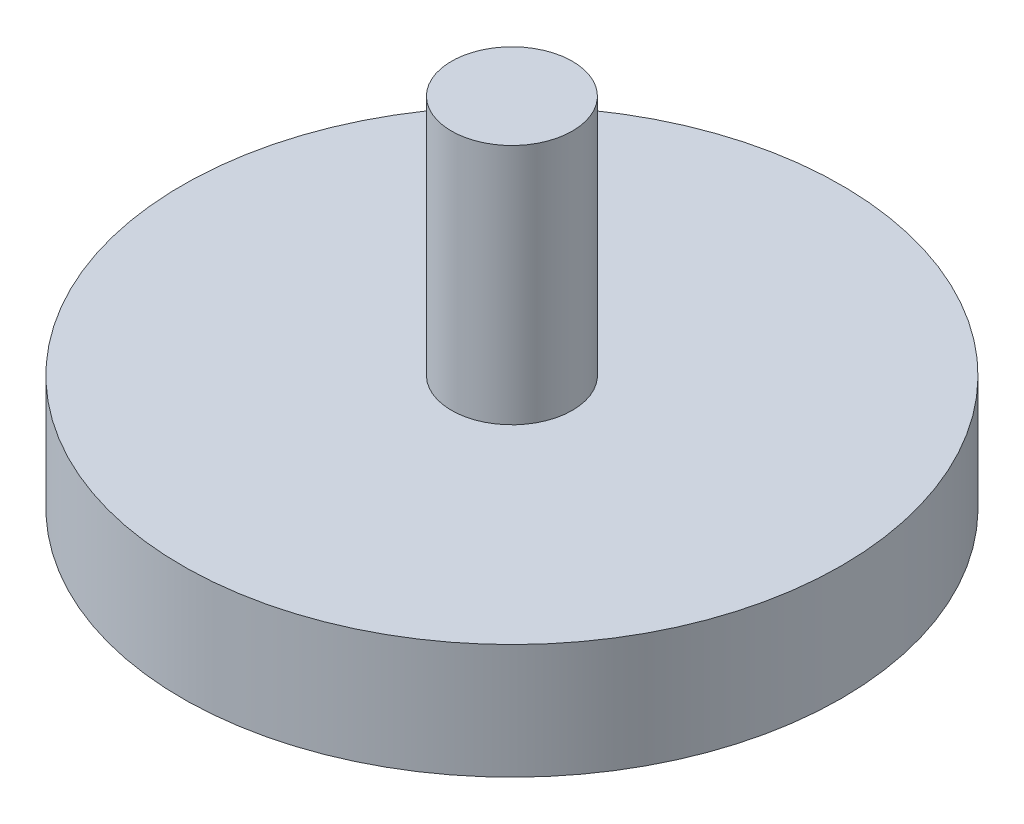
ISO-10303-21;
HEADER;
FILE_DESCRIPTION(('STEP AP214'),'2;1');
FILE_NAME('part.step','',(''),(''),'','','');
FILE_SCHEMA(('AUTOMOTIVE_DESIGN { 1 0 10303 214 1 1 1 1 }'));
ENDSEC;
DATA;
#1=APPLICATION_CONTEXT('core data for automotive mechanical design processes');
#2=APPLICATION_PROTOCOL_DEFINITION('international standard','automotive_design',2000,#1);
#3=PRODUCT_CONTEXT('',#1,'mechanical');
#4=PRODUCT('Part','Part','',(#3));
#5=PRODUCT_RELATED_PRODUCT_CATEGORY('part','',(#4));
#6=PRODUCT_DEFINITION_FORMATION('','',#4);
#7=PRODUCT_DEFINITION_CONTEXT('part definition',#1,'design');
#8=PRODUCT_DEFINITION('design','',#6,#7);
#9=PRODUCT_DEFINITION_SHAPE('','',#8);
#10=(LENGTH_UNIT() NAMED_UNIT(*) SI_UNIT(.MILLI.,.METRE.));
#11=(NAMED_UNIT(*) PLANE_ANGLE_UNIT() SI_UNIT($,.RADIAN.));
#12=(NAMED_UNIT(*) SI_UNIT($,.STERADIAN.) SOLID_ANGLE_UNIT());
#13=UNCERTAINTY_MEASURE_WITH_UNIT(LENGTH_MEASURE(1.E-05),#10,'distance_accuracy_value','');
#14=(GEOMETRIC_REPRESENTATION_CONTEXT(3) GLOBAL_UNCERTAINTY_ASSIGNED_CONTEXT((#13)) GLOBAL_UNIT_ASSIGNED_CONTEXT((#10,
#11,#12)) REPRESENTATION_CONTEXT('',''));
#15=CARTESIAN_POINT('',(0.,0.,0.));
#16=DIRECTION('',(0.,0.,1.));
#17=DIRECTION('',(1.,0.,0.));
#18=AXIS2_PLACEMENT_3D('',#15,#16,#17);
#19=CARTESIAN_POINT('',(30.,29.9999999999999,0.));
#20=DIRECTION('',(0.,-1.,0.));
#21=DIRECTION('',(1.,0.,0.));
#22=AXIS2_PLACEMENT_3D('',#19,#20,#21);
#23=PLANE('',#22);
#24=CARTESIAN_POINT('',(-1.02907469966572E-13,29.9999999999996,0.));
#25=DIRECTION('',(0.,-1.,0.));
#26=DIRECTION('',(1.,0.,0.));
#27=AXIS2_PLACEMENT_3D('',#24,#25,#26);
#28=CIRCLE('',#27,109.);
#29=CARTESIAN_POINT('',(109.,30.,0.));
#30=VERTEX_POINT('',#29);
#31=EDGE_CURVE('E110',#30,#30,#28,.T.);
#32=ORIENTED_EDGE('',*,*,#31,.T.);
#33=EDGE_LOOP('',(#32));
#34=FACE_BOUND('',#33,.T.);
#35=CARTESIAN_POINT('',(-1.02907469966574E-13,30.,0.));
#36=DIRECTION('',(0.,-1.,0.));
#37=DIRECTION('',(1.,0.,0.));
#38=AXIS2_PLACEMENT_3D('',#35,#36,#37);
#39=CIRCLE('',#38,30.0000000000001);
#40=CARTESIAN_POINT('',(-7.50000000000011,29.9999999999997,29.0473750965557));
#41=VERTEX_POINT('',#40);
#42=CARTESIAN_POINT('',(7.49999999999989,29.9999999999998,29.0473750965557));
#43=VERTEX_POINT('',#42);
#44=EDGE_CURVE('E108',#41,#43,#39,.T.);
#45=ORIENTED_EDGE('',*,*,#44,.F.);
#46=DIRECTION('',(0.,0.,-1.));
#47=VECTOR('',#46,1.);
#48=CARTESIAN_POINT('',(-7.50000000000011,29.9999999999997,45.));
#49=LINE('',#48,#47);
#50=CARTESIAN_POINT('',(-7.50000000000011,29.9999999999997,45.));
#51=VERTEX_POINT('',#50);
#52=EDGE_CURVE('E55',#51,#41,#49,.T.);
#53=ORIENTED_EDGE('',*,*,#52,.F.);
#54=DIRECTION('',(-1.,0.,0.));
#55=VECTOR('',#54,1.);
#56=CARTESIAN_POINT('',(-7.50000000000011,29.9999999999997,45.));
#57=LINE('',#56,#55);
#58=CARTESIAN_POINT('',(7.49999999999989,29.9999999999998,45.));
#59=VERTEX_POINT('',#58);
#60=EDGE_CURVE('E84',#59,#51,#57,.T.);
#61=ORIENTED_EDGE('',*,*,#60,.F.);
#62=DIRECTION('',(0.,0.,1.));
#63=VECTOR('',#62,1.);
#64=CARTESIAN_POINT('',(7.49999999999989,29.9999999999998,45.));
#65=LINE('',#64,#63);
#66=EDGE_CURVE('E74',#43,#59,#65,.T.);
#67=ORIENTED_EDGE('',*,*,#66,.F.);
#68=EDGE_LOOP('',(#45,#53,#61,#67));
#69=FACE_BOUND('',#68,.T.);
#70=ADVANCED_FACE('F32',(#34,#69),#23,.T.);
#71=CARTESIAN_POINT('',(3.43024899888577E-12,-1000.,0.));
#72=DIRECTION('',(0.,-1.,0.));
#73=DIRECTION('',(1.,0.,0.));
#74=AXIS2_PLACEMENT_3D('',#71,#72,#73);
#75=CYLINDRICAL_SURFACE('',#74,30.0000000000001);
#76=CARTESIAN_POINT('',(0.,4.99999999999989,0.));
#77=DIRECTION('',(0.,-1.,0.));
#78=DIRECTION('',(1.,0.,0.));
#79=AXIS2_PLACEMENT_3D('',#76,#77,#78);
#80=CIRCLE('',#79,30.);
#81=CARTESIAN_POINT('',(-7.50000000000002,4.99999999999984,29.0473750965556));
#82=VERTEX_POINT('',#81);
#83=CARTESIAN_POINT('',(7.49999999999998,4.99999999999989,29.0473750965556));
#84=VERTEX_POINT('',#83);
#85=EDGE_CURVE('E105',#82,#84,#80,.T.);
#86=ORIENTED_EDGE('',*,*,#85,.F.);
#87=DIRECTION('',(0.,-1.,0.));
#88=VECTOR('',#87,1.);
#89=CARTESIAN_POINT('',(-7.49999999999657,-1000.,29.0473750965557));
#90=LINE('',#89,#88);
#91=EDGE_CURVE('E96',#82,#41,#90,.F.);
#92=ORIENTED_EDGE('',*,*,#91,.T.);
#93=ORIENTED_EDGE('',*,*,#44,.T.);
#94=DIRECTION('',(0.,-1.,0.));
#95=VECTOR('',#94,1.);
#96=CARTESIAN_POINT('',(7.50000000000342,-1000.,29.0473750965557));
#97=LINE('',#96,#95);
#98=EDGE_CURVE('E79',#43,#84,#97,.T.);
#99=ORIENTED_EDGE('',*,*,#98,.T.);
#100=EDGE_LOOP('',(#86,#92,#93,#99));
#101=FACE_BOUND('',#100,.T.);
#102=ADVANCED_FACE('F131',(#101),#75,.T.);
#103=CARTESIAN_POINT('',(48.,5.00000000000003,0.));
#104=DIRECTION('',(0.,1.,0.));
#105=DIRECTION('',(-1.,0.,0.));
#106=AXIS2_PLACEMENT_3D('',#103,#104,#105);
#107=PLANE('',#106);
#108=CARTESIAN_POINT('',(0.,4.99999999999967,0.));
#109=DIRECTION('',(0.,-1.,0.));
#110=DIRECTION('',(1.,0.,0.));
#111=AXIS2_PLACEMENT_3D('',#108,#109,#110);
#112=CIRCLE('',#111,48.);
#113=CARTESIAN_POINT('',(48.,4.99999999999984,0.));
#114=VERTEX_POINT('',#113);
#115=EDGE_CURVE('E102',#114,#114,#112,.T.);
#116=ORIENTED_EDGE('',*,*,#115,.F.);
#117=EDGE_LOOP('',(#116));
#118=FACE_BOUND('',#117,.T.);
#119=DIRECTION('',(1.,0.,0.));
#120=VECTOR('',#119,1.);
#121=CARTESIAN_POINT('',(-7.50000000000003,4.99999999999984,45.));
#122=LINE('',#121,#120);
#123=CARTESIAN_POINT('',(-7.50000000000003,4.99999999999984,45.));
#124=VERTEX_POINT('',#123);
#125=CARTESIAN_POINT('',(7.49999999999997,4.99999999999989,45.));
#126=VERTEX_POINT('',#125);
#127=EDGE_CURVE('E47',#124,#126,#122,.T.);
#128=ORIENTED_EDGE('',*,*,#127,.F.);
#129=DIRECTION('',(0.,0.,-1.));
#130=VECTOR('',#129,1.);
#131=CARTESIAN_POINT('',(-7.50000000000001,4.99999999999984,0.));
#132=LINE('',#131,#130);
#133=EDGE_CURVE('E11',#124,#82,#132,.T.);
#134=ORIENTED_EDGE('',*,*,#133,.T.);
#135=ORIENTED_EDGE('',*,*,#85,.T.);
#136=DIRECTION('',(0.,0.,-1.));
#137=VECTOR('',#136,1.);
#138=CARTESIAN_POINT('',(7.49999999999997,4.99999999999989,45.));
#139=LINE('',#138,#137);
#140=EDGE_CURVE('E97',#126,#84,#139,.T.);
#141=ORIENTED_EDGE('',*,*,#140,.F.);
#142=EDGE_LOOP('',(#128,#134,#135,#141));
#143=FACE_BOUND('',#142,.T.);
#144=ADVANCED_FACE('F125',(#118,#143),#107,.T.);
#145=CARTESIAN_POINT('',(0.,148.,0.));
#146=DIRECTION('',(0.,1.,0.));
#147=DIRECTION('',(-1.,0.,0.));
#148=AXIS2_PLACEMENT_3D('',#145,#146,#147);
#149=PLANE('',#148);
#150=CARTESIAN_POINT('',(-5.07676851835094E-13,148.,0.));
#151=DIRECTION('',(0.,-1.,0.));
#152=DIRECTION('',(1.,0.,0.));
#153=AXIS2_PLACEMENT_3D('',#150,#151,#152);
#154=CIRCLE('',#153,20.0000000000005);
#155=CARTESIAN_POINT('',(20.,148.,0.));
#156=VERTEX_POINT('',#155);
#157=EDGE_CURVE('E40',#156,#156,#154,.T.);
#158=ORIENTED_EDGE('',*,*,#157,.F.);
#159=EDGE_LOOP('',(#158));
#160=FACE_BOUND('',#159,.T.);
#161=ADVANCED_FACE('F34',(#160),#149,.T.);
#162=CARTESIAN_POINT('',(3.43024899888577E-12,-1000.,0.));
#163=DIRECTION('',(0.,-1.,0.));
#164=DIRECTION('',(1.,0.,0.));
#165=AXIS2_PLACEMENT_3D('',#162,#163,#164);
#166=CYLINDRICAL_SURFACE('',#165,20.0000000000004);
#167=ORIENTED_EDGE('',*,*,#157,.T.);
#168=EDGE_LOOP('',(#167));
#169=FACE_BOUND('',#168,.T.);
#170=CARTESIAN_POINT('',(-2.33256931924233E-13,68.0000000000001,0.));
#171=DIRECTION('',(0.,-1.,0.));
#172=DIRECTION('',(1.,0.,0.));
#173=AXIS2_PLACEMENT_3D('',#170,#171,#172);
#174=CIRCLE('',#173,20.0000000000002);
#175=CARTESIAN_POINT('',(20.,68.0000000000001,0.));
#176=VERTEX_POINT('',#175);
#177=EDGE_CURVE('E116',#176,#176,#174,.T.);
#178=ORIENTED_EDGE('',*,*,#177,.F.);
#179=EDGE_LOOP('',(#178));
#180=FACE_BOUND('',#179,.T.);
#181=ADVANCED_FACE('F121',(#169,#180),#166,.T.);
#182=CARTESIAN_POINT('',(20.,67.9999999999999,0.));
#183=DIRECTION('',(0.,1.,0.));
#184=DIRECTION('',(-1.,0.,0.));
#185=AXIS2_PLACEMENT_3D('',#182,#183,#184);
#186=PLANE('',#185);
#187=ORIENTED_EDGE('',*,*,#177,.T.);
#188=EDGE_LOOP('',(#187));
#189=FACE_BOUND('',#188,.T.);
#190=CARTESIAN_POINT('',(-2.33256931924231E-13,67.9999999999996,0.));
#191=DIRECTION('',(0.,-1.,0.));
#192=DIRECTION('',(1.,0.,0.));
#193=AXIS2_PLACEMENT_3D('',#190,#191,#192);
#194=CIRCLE('',#193,109.);
#195=CARTESIAN_POINT('',(109.,68.,0.));
#196=VERTEX_POINT('',#195);
#197=EDGE_CURVE('E113',#196,#196,#194,.T.);
#198=ORIENTED_EDGE('',*,*,#197,.F.);
#199=EDGE_LOOP('',(#198));
#200=FACE_BOUND('',#199,.T.);
#201=ADVANCED_FACE('F130',(#189,#200),#186,.T.);
#202=CARTESIAN_POINT('',(3.43024899888577E-12,-1000.,0.));
#203=DIRECTION('',(0.,-1.,0.));
#204=DIRECTION('',(1.,0.,0.));
#205=AXIS2_PLACEMENT_3D('',#202,#203,#204);
#206=CYLINDRICAL_SURFACE('',#205,109.);
#207=ORIENTED_EDGE('',*,*,#197,.T.);
#208=EDGE_LOOP('',(#207));
#209=FACE_BOUND('',#208,.T.);
#210=ORIENTED_EDGE('',*,*,#31,.F.);
#211=EDGE_LOOP('',(#210));
#212=FACE_BOUND('',#211,.T.);
#213=ADVANCED_FACE('F143',(#209,#212),#206,.T.);
#214=CARTESIAN_POINT('',(3.43024899888577E-12,-1000.,0.));
#215=DIRECTION('',(0.,-1.,0.));
#216=DIRECTION('',(1.,0.,0.));
#217=AXIS2_PLACEMENT_3D('',#214,#215,#216);
#218=CYLINDRICAL_SURFACE('',#217,48.);
#219=ORIENTED_EDGE('',*,*,#115,.T.);
#220=EDGE_LOOP('',(#219));
#221=FACE_BOUND('',#220,.T.);
#222=CARTESIAN_POINT('',(0.,-1.11022302462516E-13,0.));
#223=DIRECTION('',(0.,-1.,0.));
#224=DIRECTION('',(1.,0.,0.));
#225=AXIS2_PLACEMENT_3D('',#222,#223,#224);
#226=CIRCLE('',#225,48.);
#227=CARTESIAN_POINT('',(48.,0.,0.));
#228=VERTEX_POINT('',#227);
#229=EDGE_CURVE('E99',#228,#228,#226,.T.);
#230=ORIENTED_EDGE('',*,*,#229,.F.);
#231=EDGE_LOOP('',(#230));
#232=FACE_BOUND('',#231,.T.);
#233=ADVANCED_FACE('F146',(#221,#232),#218,.T.);
#234=CARTESIAN_POINT('',(0.,0.,0.));
#235=DIRECTION('',(0.,-1.,0.));
#236=DIRECTION('',(1.,0.,0.));
#237=AXIS2_PLACEMENT_3D('',#234,#235,#236);
#238=PLANE('',#237);
#239=ORIENTED_EDGE('',*,*,#229,.T.);
#240=EDGE_LOOP('',(#239));
#241=FACE_BOUND('',#240,.T.);
#242=ADVANCED_FACE('F169',(#241),#238,.T.);
#243=CARTESIAN_POINT('',(-7.49999999999986,-42.4341649025259,45.));
#244=DIRECTION('',(1.,0.,0.));
#245=DIRECTION('',(0.,1.,0.));
#246=AXIS2_PLACEMENT_3D('',#243,#244,#245);
#247=PLANE('',#246);
#248=ORIENTED_EDGE('',*,*,#91,.F.);
#249=ORIENTED_EDGE('',*,*,#133,.F.);
#250=DIRECTION('',(0.,1.,0.));
#251=VECTOR('',#250,1.);
#252=CARTESIAN_POINT('',(-7.49999999999986,-42.4341649025259,45.));
#253=LINE('',#252,#251);
#254=EDGE_CURVE('E88',#124,#51,#253,.T.);
#255=ORIENTED_EDGE('',*,*,#254,.T.);
#256=ORIENTED_EDGE('',*,*,#52,.T.);
#257=EDGE_LOOP('',(#248,#249,#255,#256));
#258=FACE_BOUND('',#257,.T.);
#259=ADVANCED_FACE('F177',(#258),#247,.F.);
#260=CARTESIAN_POINT('',(-7.49999999999986,-42.4341649025259,45.));
#261=DIRECTION('',(0.,0.,-1.));
#262=DIRECTION('',(-1.,0.,0.));
#263=AXIS2_PLACEMENT_3D('',#260,#261,#262);
#264=PLANE('',#263);
#265=ORIENTED_EDGE('',*,*,#254,.F.);
#266=ORIENTED_EDGE('',*,*,#127,.T.);
#267=DIRECTION('',(0.,1.,0.));
#268=VECTOR('',#267,1.);
#269=CARTESIAN_POINT('',(7.50000000000013,-42.4341649025258,45.));
#270=LINE('',#269,#268);
#271=EDGE_CURVE('E76',#126,#59,#270,.T.);
#272=ORIENTED_EDGE('',*,*,#271,.T.);
#273=ORIENTED_EDGE('',*,*,#60,.T.);
#274=EDGE_LOOP('',(#265,#266,#272,#273));
#275=FACE_BOUND('',#274,.T.);
#276=ADVANCED_FACE('F87',(#275),#264,.F.);
#277=CARTESIAN_POINT('',(7.50000000000013,-42.4341649025258,45.));
#278=DIRECTION('',(-1.,0.,0.));
#279=DIRECTION('',(0.,-1.,0.));
#280=AXIS2_PLACEMENT_3D('',#277,#278,#279);
#281=PLANE('',#280);
#282=ORIENTED_EDGE('',*,*,#98,.F.);
#283=ORIENTED_EDGE('',*,*,#66,.T.);
#284=ORIENTED_EDGE('',*,*,#271,.F.);
#285=ORIENTED_EDGE('',*,*,#140,.T.);
#286=EDGE_LOOP('',(#282,#283,#284,#285));
#287=FACE_BOUND('',#286,.T.);
#288=ADVANCED_FACE('F75',(#287),#281,.F.);
#289=CLOSED_SHELL('',(#70,#102,#144,#161,#181,#201,#213,#233,#242,#259,#276,#288));
#290=MANIFOLD_SOLID_BREP('B2',#289);
#291=ADVANCED_BREP_SHAPE_REPRESENTATION('',(#18,#290),#14);
#292=SHAPE_DEFINITION_REPRESENTATION(#9,#291);
ENDSEC;
END-ISO-10303-21;
